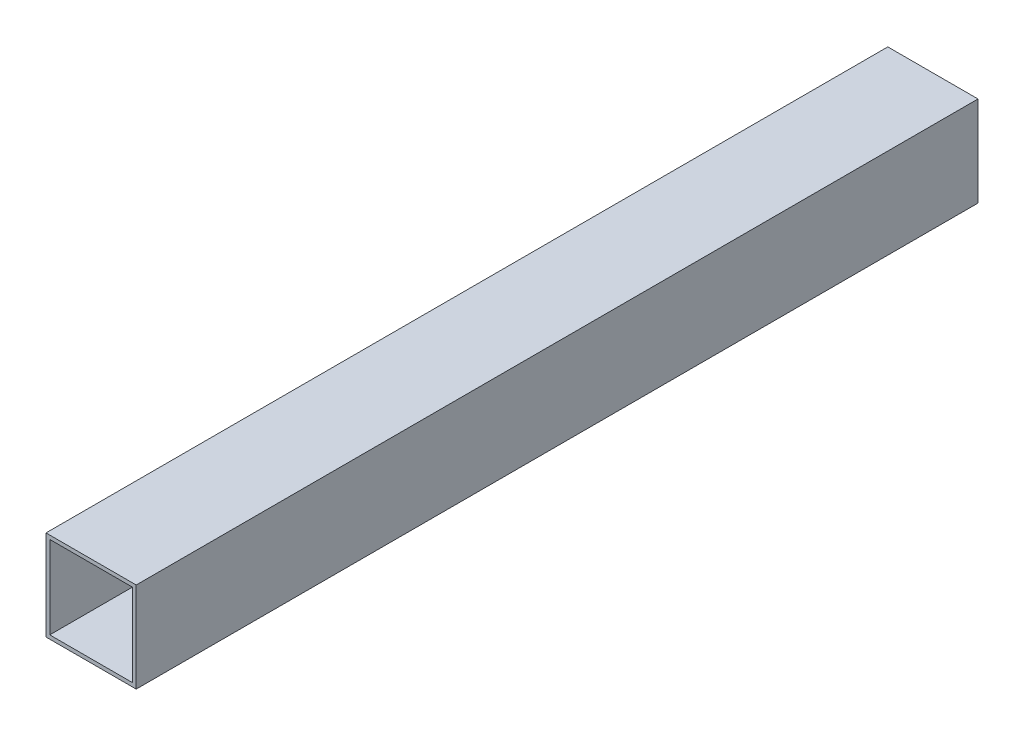
ISO-10303-21;
HEADER;
FILE_DESCRIPTION(('STEP AP214'),'2;1');
FILE_NAME('part.step','',(''),(''),'','','');
FILE_SCHEMA(('AUTOMOTIVE_DESIGN { 1 0 10303 214 1 1 1 1 }'));
ENDSEC;
DATA;
#1=APPLICATION_CONTEXT('core data for automotive mechanical design processes');
#2=APPLICATION_PROTOCOL_DEFINITION('international standard','automotive_design',2000,#1);
#3=PRODUCT_CONTEXT('',#1,'mechanical');
#4=PRODUCT('Part','Part','',(#3));
#5=PRODUCT_RELATED_PRODUCT_CATEGORY('part','',(#4));
#6=PRODUCT_DEFINITION_FORMATION('','',#4);
#7=PRODUCT_DEFINITION_CONTEXT('part definition',#1,'design');
#8=PRODUCT_DEFINITION('design','',#6,#7);
#9=PRODUCT_DEFINITION_SHAPE('','',#8);
#10=(LENGTH_UNIT() NAMED_UNIT(*) SI_UNIT(.MILLI.,.METRE.));
#11=(NAMED_UNIT(*) PLANE_ANGLE_UNIT() SI_UNIT($,.RADIAN.));
#12=(NAMED_UNIT(*) SI_UNIT($,.STERADIAN.) SOLID_ANGLE_UNIT());
#13=UNCERTAINTY_MEASURE_WITH_UNIT(LENGTH_MEASURE(1.E-05),#10,'distance_accuracy_value','');
#14=(GEOMETRIC_REPRESENTATION_CONTEXT(3) GLOBAL_UNCERTAINTY_ASSIGNED_CONTEXT((#13)) GLOBAL_UNIT_ASSIGNED_CONTEXT((#10,
#11,#12)) REPRESENTATION_CONTEXT('',''));
#15=CARTESIAN_POINT('',(0.,0.,0.));
#16=DIRECTION('',(0.,0.,1.));
#17=DIRECTION('',(1.,0.,0.));
#18=AXIS2_PLACEMENT_3D('',#15,#16,#17);
#19=CARTESIAN_POINT('',(0.,0.,711.2));
#20=DIRECTION('',(0.,0.,-1.));
#21=DIRECTION('',(-1.,0.,0.));
#22=AXIS2_PLACEMENT_3D('',#19,#20,#21);
#23=PLANE('',#22);
#24=DIRECTION('',(1.,0.,0.));
#25=VECTOR('',#24,1.);
#26=CARTESIAN_POINT('',(-40.7297095879192,18.6309754178664,711.2));
#27=LINE('',#26,#25);
#28=CARTESIAN_POINT('',(-40.7297095879192,18.6309754178664,711.2));
#29=VERTEX_POINT('',#28);
#30=CARTESIAN_POINT('',(35.4702904120808,18.6309754178664,711.2));
#31=VERTEX_POINT('',#30);
#32=EDGE_CURVE('E143',#29,#31,#27,.T.);
#33=ORIENTED_EDGE('',*,*,#32,.F.);
#34=DIRECTION('',(0.,-1.,0.));
#35=VECTOR('',#34,1.);
#36=CARTESIAN_POINT('',(-40.7297095879192,18.6309754178664,711.2));
#37=LINE('',#36,#35);
#38=CARTESIAN_POINT('',(-40.7297095879192,-57.5690245821336,711.2));
#39=VERTEX_POINT('',#38);
#40=EDGE_CURVE('E152',#29,#39,#37,.T.);
#41=ORIENTED_EDGE('',*,*,#40,.T.);
#42=DIRECTION('',(1.,0.,0.));
#43=VECTOR('',#42,1.);
#44=CARTESIAN_POINT('',(-40.7297095879192,-57.5690245821336,711.2));
#45=LINE('',#44,#43);
#46=CARTESIAN_POINT('',(35.4702904120808,-57.5690245821336,711.2));
#47=VERTEX_POINT('',#46);
#48=EDGE_CURVE('E150',#39,#47,#45,.T.);
#49=ORIENTED_EDGE('',*,*,#48,.T.);
#50=DIRECTION('',(0.,-1.,0.));
#51=VECTOR('',#50,1.);
#52=CARTESIAN_POINT('',(35.4702904120808,18.6309754178664,711.2));
#53=LINE('',#52,#51);
#54=EDGE_CURVE('E146',#31,#47,#53,.T.);
#55=ORIENTED_EDGE('',*,*,#54,.F.);
#56=EDGE_LOOP('',(#33,#41,#49,#55));
#57=FACE_BOUND('',#56,.T.);
#58=DIRECTION('',(1.,0.,0.));
#59=VECTOR('',#58,1.);
#60=CARTESIAN_POINT('',(-37.5547095879192,15.4559754178664,711.2));
#61=LINE('',#60,#59);
#62=CARTESIAN_POINT('',(-37.5547095879192,15.4559754178664,711.2));
#63=VERTEX_POINT('',#62);
#64=CARTESIAN_POINT('',(32.2952904120808,15.4559754178664,711.2));
#65=VERTEX_POINT('',#64);
#66=EDGE_CURVE('E58',#63,#65,#61,.T.);
#67=ORIENTED_EDGE('',*,*,#66,.T.);
#68=DIRECTION('',(0.,-1.,0.));
#69=VECTOR('',#68,1.);
#70=CARTESIAN_POINT('',(32.2952904120808,15.4559754178664,711.2));
#71=LINE('',#70,#69);
#72=CARTESIAN_POINT('',(32.2952904120808,-54.3940245821336,711.2));
#73=VERTEX_POINT('',#72);
#74=EDGE_CURVE('E122',#65,#73,#71,.T.);
#75=ORIENTED_EDGE('',*,*,#74,.T.);
#76=DIRECTION('',(1.,0.,0.));
#77=VECTOR('',#76,1.);
#78=CARTESIAN_POINT('',(-37.5547095879192,-54.3940245821336,711.2));
#79=LINE('',#78,#77);
#80=CARTESIAN_POINT('',(-37.5547095879192,-54.3940245821336,711.2));
#81=VERTEX_POINT('',#80);
#82=EDGE_CURVE('E134',#81,#73,#79,.T.);
#83=ORIENTED_EDGE('',*,*,#82,.F.);
#84=DIRECTION('',(0.,-1.,0.));
#85=VECTOR('',#84,1.);
#86=CARTESIAN_POINT('',(-37.5547095879192,15.4559754178664,711.2));
#87=LINE('',#86,#85);
#88=EDGE_CURVE('E117',#63,#81,#87,.T.);
#89=ORIENTED_EDGE('',*,*,#88,.F.);
#90=EDGE_LOOP('',(#67,#75,#83,#89));
#91=FACE_BOUND('',#90,.T.);
#92=ADVANCED_FACE('F41',(#57,#91),#23,.F.);
#93=CARTESIAN_POINT('',(0.,0.,0.));
#94=DIRECTION('',(0.,0.,-1.));
#95=DIRECTION('',(-1.,0.,0.));
#96=AXIS2_PLACEMENT_3D('',#93,#94,#95);
#97=PLANE('',#96);
#98=DIRECTION('',(1.,0.,0.));
#99=VECTOR('',#98,1.);
#100=CARTESIAN_POINT('',(-40.7297095879192,18.6309754178664,0.));
#101=LINE('',#100,#99);
#102=CARTESIAN_POINT('',(-40.7297095879192,18.6309754178664,0.));
#103=VERTEX_POINT('',#102);
#104=CARTESIAN_POINT('',(35.4702904120808,18.6309754178664,0.));
#105=VERTEX_POINT('',#104);
#106=EDGE_CURVE('E123',#103,#105,#101,.T.);
#107=ORIENTED_EDGE('',*,*,#106,.T.);
#108=DIRECTION('',(0.,-1.,0.));
#109=VECTOR('',#108,1.);
#110=CARTESIAN_POINT('',(35.4702904120808,18.6309754178664,0.));
#111=LINE('',#110,#109);
#112=CARTESIAN_POINT('',(35.4702904120808,-57.5690245821336,0.));
#113=VERTEX_POINT('',#112);
#114=EDGE_CURVE('E156',#105,#113,#111,.T.);
#115=ORIENTED_EDGE('',*,*,#114,.T.);
#116=DIRECTION('',(1.,0.,0.));
#117=VECTOR('',#116,1.);
#118=CARTESIAN_POINT('',(-40.7297095879192,-57.5690245821336,0.));
#119=LINE('',#118,#117);
#120=CARTESIAN_POINT('',(-40.7297095879192,-57.5690245821336,0.));
#121=VERTEX_POINT('',#120);
#122=EDGE_CURVE('E159',#121,#113,#119,.T.);
#123=ORIENTED_EDGE('',*,*,#122,.F.);
#124=DIRECTION('',(0.,-1.,0.));
#125=VECTOR('',#124,1.);
#126=CARTESIAN_POINT('',(-40.7297095879192,18.6309754178664,0.));
#127=LINE('',#126,#125);
#128=EDGE_CURVE('E147',#103,#121,#127,.T.);
#129=ORIENTED_EDGE('',*,*,#128,.F.);
#130=EDGE_LOOP('',(#107,#115,#123,#129));
#131=FACE_BOUND('',#130,.T.);
#132=DIRECTION('',(0.,-1.,0.));
#133=VECTOR('',#132,1.);
#134=CARTESIAN_POINT('',(32.2952904120808,15.4559754178664,0.));
#135=LINE('',#134,#133);
#136=CARTESIAN_POINT('',(32.2952904120808,15.4559754178664,0.));
#137=VERTEX_POINT('',#136);
#138=CARTESIAN_POINT('',(32.2952904120808,-54.3940245821336,0.));
#139=VERTEX_POINT('',#138);
#140=EDGE_CURVE('E116',#137,#139,#135,.T.);
#141=ORIENTED_EDGE('',*,*,#140,.F.);
#142=DIRECTION('',(1.,0.,0.));
#143=VECTOR('',#142,1.);
#144=CARTESIAN_POINT('',(-37.5547095879192,15.4559754178664,0.));
#145=LINE('',#144,#143);
#146=CARTESIAN_POINT('',(-37.5547095879192,15.4559754178664,0.));
#147=VERTEX_POINT('',#146);
#148=EDGE_CURVE('E107',#147,#137,#145,.T.);
#149=ORIENTED_EDGE('',*,*,#148,.F.);
#150=DIRECTION('',(0.,-1.,0.));
#151=VECTOR('',#150,1.);
#152=CARTESIAN_POINT('',(-37.5547095879192,15.4559754178664,0.));
#153=LINE('',#152,#151);
#154=CARTESIAN_POINT('',(-37.5547095879192,-54.3940245821336,0.));
#155=VERTEX_POINT('',#154);
#156=EDGE_CURVE('E128',#147,#155,#153,.T.);
#157=ORIENTED_EDGE('',*,*,#156,.T.);
#158=DIRECTION('',(1.,0.,0.));
#159=VECTOR('',#158,1.);
#160=CARTESIAN_POINT('',(-37.5547095879192,-54.3940245821336,0.));
#161=LINE('',#160,#159);
#162=EDGE_CURVE('E66',#155,#139,#161,.T.);
#163=ORIENTED_EDGE('',*,*,#162,.T.);
#164=EDGE_LOOP('',(#141,#149,#157,#163));
#165=FACE_BOUND('',#164,.T.);
#166=ADVANCED_FACE('F126',(#131,#165),#97,.T.);
#167=CARTESIAN_POINT('',(-40.7297095879192,18.6309754178664,711.2));
#168=DIRECTION('',(0.,1.,0.));
#169=DIRECTION('',(0.,0.,1.));
#170=AXIS2_PLACEMENT_3D('',#167,#168,#169);
#171=PLANE('',#170);
#172=ORIENTED_EDGE('',*,*,#106,.F.);
#173=DIRECTION('',(0.,0.,-1.));
#174=VECTOR('',#173,1.);
#175=CARTESIAN_POINT('',(-40.7297095879192,18.6309754178664,711.2));
#176=LINE('',#175,#174);
#177=EDGE_CURVE('E11',#29,#103,#176,.T.);
#178=ORIENTED_EDGE('',*,*,#177,.F.);
#179=ORIENTED_EDGE('',*,*,#32,.T.);
#180=DIRECTION('',(0.,0.,-1.));
#181=VECTOR('',#180,1.);
#182=CARTESIAN_POINT('',(35.4702904120808,18.6309754178664,711.2));
#183=LINE('',#182,#181);
#184=EDGE_CURVE('E45',#31,#105,#183,.T.);
#185=ORIENTED_EDGE('',*,*,#184,.T.);
#186=EDGE_LOOP('',(#172,#178,#179,#185));
#187=FACE_BOUND('',#186,.T.);
#188=ADVANCED_FACE('F43',(#187),#171,.T.);
#189=CARTESIAN_POINT('',(-40.7297095879192,18.6309754178664,711.2));
#190=DIRECTION('',(1.,0.,0.));
#191=DIRECTION('',(0.,0.,-1.));
#192=AXIS2_PLACEMENT_3D('',#189,#190,#191);
#193=PLANE('',#192);
#194=ORIENTED_EDGE('',*,*,#128,.T.);
#195=DIRECTION('',(0.,0.,-1.));
#196=VECTOR('',#195,1.);
#197=CARTESIAN_POINT('',(-40.7297095879192,-57.5690245821336,711.2));
#198=LINE('',#197,#196);
#199=EDGE_CURVE('E50',#39,#121,#198,.T.);
#200=ORIENTED_EDGE('',*,*,#199,.F.);
#201=ORIENTED_EDGE('',*,*,#40,.F.);
#202=ORIENTED_EDGE('',*,*,#177,.T.);
#203=EDGE_LOOP('',(#194,#200,#201,#202));
#204=FACE_BOUND('',#203,.T.);
#205=ADVANCED_FACE('F178',(#204),#193,.F.);
#206=CARTESIAN_POINT('',(-40.7297095879192,-57.5690245821336,711.2));
#207=DIRECTION('',(0.,1.,0.));
#208=DIRECTION('',(-1.,0.,0.));
#209=AXIS2_PLACEMENT_3D('',#206,#207,#208);
#210=PLANE('',#209);
#211=ORIENTED_EDGE('',*,*,#122,.T.);
#212=DIRECTION('',(0.,0.,-1.));
#213=VECTOR('',#212,1.);
#214=CARTESIAN_POINT('',(35.4702904120808,-57.5690245821336,711.2));
#215=LINE('',#214,#213);
#216=EDGE_CURVE('E164',#47,#113,#215,.T.);
#217=ORIENTED_EDGE('',*,*,#216,.F.);
#218=ORIENTED_EDGE('',*,*,#48,.F.);
#219=ORIENTED_EDGE('',*,*,#199,.T.);
#220=EDGE_LOOP('',(#211,#217,#218,#219));
#221=FACE_BOUND('',#220,.T.);
#222=ADVANCED_FACE('F182',(#221),#210,.F.);
#223=CARTESIAN_POINT('',(35.4702904120808,18.6309754178664,711.2));
#224=DIRECTION('',(1.,0.,0.));
#225=DIRECTION('',(0.,0.,-1.));
#226=AXIS2_PLACEMENT_3D('',#223,#224,#225);
#227=PLANE('',#226);
#228=ORIENTED_EDGE('',*,*,#114,.F.);
#229=ORIENTED_EDGE('',*,*,#184,.F.);
#230=ORIENTED_EDGE('',*,*,#54,.T.);
#231=ORIENTED_EDGE('',*,*,#216,.T.);
#232=EDGE_LOOP('',(#228,#229,#230,#231));
#233=FACE_BOUND('',#232,.T.);
#234=ADVANCED_FACE('F172',(#233),#227,.T.);
#235=CARTESIAN_POINT('',(-37.5547095879192,15.4559754178664,0.));
#236=DIRECTION('',(0.,-1.,0.));
#237=DIRECTION('',(0.,0.,-1.));
#238=AXIS2_PLACEMENT_3D('',#235,#236,#237);
#239=PLANE('',#238);
#240=ORIENTED_EDGE('',*,*,#66,.F.);
#241=DIRECTION('',(0.,0.,1.));
#242=VECTOR('',#241,1.);
#243=CARTESIAN_POINT('',(-37.5547095879192,15.4559754178664,0.));
#244=LINE('',#243,#242);
#245=EDGE_CURVE('E111',#147,#63,#244,.T.);
#246=ORIENTED_EDGE('',*,*,#245,.F.);
#247=ORIENTED_EDGE('',*,*,#148,.T.);
#248=DIRECTION('',(0.,0.,1.));
#249=VECTOR('',#248,1.);
#250=CARTESIAN_POINT('',(32.2952904120808,15.4559754178664,0.));
#251=LINE('',#250,#249);
#252=EDGE_CURVE('E110',#137,#65,#251,.T.);
#253=ORIENTED_EDGE('',*,*,#252,.T.);
#254=EDGE_LOOP('',(#240,#246,#247,#253));
#255=FACE_BOUND('',#254,.T.);
#256=ADVANCED_FACE('F109',(#255),#239,.T.);
#257=CARTESIAN_POINT('',(32.2952904120808,15.4559754178664,0.));
#258=DIRECTION('',(-1.,0.,0.));
#259=DIRECTION('',(0.,-1.,0.));
#260=AXIS2_PLACEMENT_3D('',#257,#258,#259);
#261=PLANE('',#260);
#262=ORIENTED_EDGE('',*,*,#74,.F.);
#263=ORIENTED_EDGE('',*,*,#252,.F.);
#264=ORIENTED_EDGE('',*,*,#140,.T.);
#265=DIRECTION('',(0.,0.,1.));
#266=VECTOR('',#265,1.);
#267=CARTESIAN_POINT('',(32.2952904120808,-54.3940245821336,0.));
#268=LINE('',#267,#266);
#269=EDGE_CURVE('E124',#139,#73,#268,.T.);
#270=ORIENTED_EDGE('',*,*,#269,.T.);
#271=EDGE_LOOP('',(#262,#263,#264,#270));
#272=FACE_BOUND('',#271,.T.);
#273=ADVANCED_FACE('F120',(#272),#261,.T.);
#274=CARTESIAN_POINT('',(-37.5547095879192,-54.3940245821336,0.));
#275=DIRECTION('',(0.,-1.,0.));
#276=DIRECTION('',(0.,0.,-1.));
#277=AXIS2_PLACEMENT_3D('',#274,#275,#276);
#278=PLANE('',#277);
#279=ORIENTED_EDGE('',*,*,#82,.T.);
#280=ORIENTED_EDGE('',*,*,#269,.F.);
#281=ORIENTED_EDGE('',*,*,#162,.F.);
#282=DIRECTION('',(0.,0.,1.));
#283=VECTOR('',#282,1.);
#284=CARTESIAN_POINT('',(-37.5547095879192,-54.3940245821336,0.));
#285=LINE('',#284,#283);
#286=EDGE_CURVE('E140',#155,#81,#285,.T.);
#287=ORIENTED_EDGE('',*,*,#286,.T.);
#288=EDGE_LOOP('',(#279,#280,#281,#287));
#289=FACE_BOUND('',#288,.T.);
#290=ADVANCED_FACE('F191',(#289),#278,.F.);
#291=CARTESIAN_POINT('',(-37.5547095879192,15.4559754178664,0.));
#292=DIRECTION('',(-1.,0.,0.));
#293=DIRECTION('',(0.,-1.,0.));
#294=AXIS2_PLACEMENT_3D('',#291,#292,#293);
#295=PLANE('',#294);
#296=ORIENTED_EDGE('',*,*,#88,.T.);
#297=ORIENTED_EDGE('',*,*,#286,.F.);
#298=ORIENTED_EDGE('',*,*,#156,.F.);
#299=ORIENTED_EDGE('',*,*,#245,.T.);
#300=EDGE_LOOP('',(#296,#297,#298,#299));
#301=FACE_BOUND('',#300,.T.);
#302=ADVANCED_FACE('F190',(#301),#295,.F.);
#303=CLOSED_SHELL('',(#92,#166,#188,#205,#222,#234,#256,#273,#290,#302));
#304=MANIFOLD_SOLID_BREP('B2',#303);
#305=ADVANCED_BREP_SHAPE_REPRESENTATION('',(#18,#304),#14);
#306=SHAPE_DEFINITION_REPRESENTATION(#9,#305);
ENDSEC;
END-ISO-10303-21;
